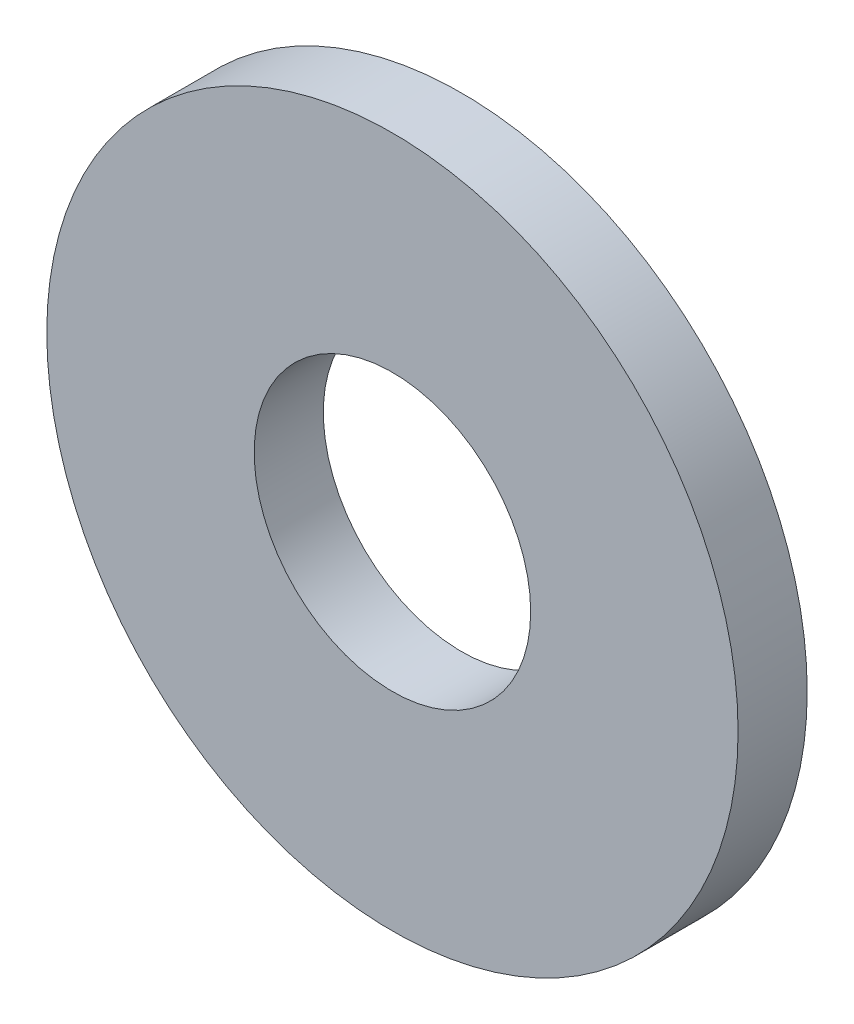
ISO-10303-21;
HEADER;
FILE_DESCRIPTION(('STEP AP214'),'2;1');
FILE_NAME('part.step','',(''),(''),'','','');
FILE_SCHEMA(('AUTOMOTIVE_DESIGN { 1 0 10303 214 1 1 1 1 }'));
ENDSEC;
DATA;
#1=APPLICATION_CONTEXT('core data for automotive mechanical design processes');
#2=APPLICATION_PROTOCOL_DEFINITION('international standard','automotive_design',2000,#1);
#3=PRODUCT_CONTEXT('',#1,'mechanical');
#4=PRODUCT('Part','Part','',(#3));
#5=PRODUCT_RELATED_PRODUCT_CATEGORY('part','',(#4));
#6=PRODUCT_DEFINITION_FORMATION('','',#4);
#7=PRODUCT_DEFINITION_CONTEXT('part definition',#1,'design');
#8=PRODUCT_DEFINITION('design','',#6,#7);
#9=PRODUCT_DEFINITION_SHAPE('','',#8);
#10=(LENGTH_UNIT() NAMED_UNIT(*) SI_UNIT(.MILLI.,.METRE.));
#11=(NAMED_UNIT(*) PLANE_ANGLE_UNIT() SI_UNIT($,.RADIAN.));
#12=(NAMED_UNIT(*) SI_UNIT($,.STERADIAN.) SOLID_ANGLE_UNIT());
#13=UNCERTAINTY_MEASURE_WITH_UNIT(LENGTH_MEASURE(1.E-05),#10,'distance_accuracy_value','');
#14=(GEOMETRIC_REPRESENTATION_CONTEXT(3) GLOBAL_UNCERTAINTY_ASSIGNED_CONTEXT((#13)) GLOBAL_UNIT_ASSIGNED_CONTEXT((#10,
#11,#12)) REPRESENTATION_CONTEXT('',''));
#15=CARTESIAN_POINT('',(0.,0.,0.));
#16=DIRECTION('',(0.,0.,1.));
#17=DIRECTION('',(1.,0.,0.));
#18=AXIS2_PLACEMENT_3D('',#15,#16,#17);
#19=CARTESIAN_POINT('',(0.,0.,0.8));
#20=DIRECTION('',(0.,0.,1.));
#21=DIRECTION('',(1.,0.,0.));
#22=AXIS2_PLACEMENT_3D('',#19,#20,#21);
#23=PLANE('',#22);
#24=CARTESIAN_POINT('',(0.,0.,0.8));
#25=DIRECTION('',(0.,0.,1.));
#26=DIRECTION('',(1.,0.,0.));
#27=AXIS2_PLACEMENT_3D('',#24,#25,#26);
#28=CIRCLE('',#27,4.);
#29=CARTESIAN_POINT('',(4.,0.,0.8));
#30=VERTEX_POINT('',#29);
#31=EDGE_CURVE('E10',#30,#30,#28,.T.);
#32=ORIENTED_EDGE('',*,*,#31,.T.);
#33=EDGE_LOOP('',(#32));
#34=FACE_BOUND('',#33,.T.);
#35=CARTESIAN_POINT('',(0.,0.,0.8));
#36=DIRECTION('',(0.,0.,1.));
#37=DIRECTION('',(1.,0.,0.));
#38=AXIS2_PLACEMENT_3D('',#35,#36,#37);
#39=CIRCLE('',#38,1.6);
#40=CARTESIAN_POINT('',(1.6,0.,0.8));
#41=VERTEX_POINT('',#40);
#42=EDGE_CURVE('E52',#41,#41,#39,.T.);
#43=ORIENTED_EDGE('',*,*,#42,.F.);
#44=EDGE_LOOP('',(#43));
#45=FACE_BOUND('',#44,.T.);
#46=ADVANCED_FACE('F41',(#34,#45),#23,.T.);
#47=CARTESIAN_POINT('',(0.,0.,0.));
#48=DIRECTION('',(0.,0.,1.));
#49=DIRECTION('',(1.,0.,0.));
#50=AXIS2_PLACEMENT_3D('',#47,#48,#49);
#51=PLANE('',#50);
#52=CARTESIAN_POINT('',(0.,0.,0.));
#53=DIRECTION('',(0.,0.,1.));
#54=DIRECTION('',(1.,0.,0.));
#55=AXIS2_PLACEMENT_3D('',#52,#53,#54);
#56=CIRCLE('',#55,4.);
#57=CARTESIAN_POINT('',(4.,0.,0.));
#58=VERTEX_POINT('',#57);
#59=EDGE_CURVE('E45',#58,#58,#56,.T.);
#60=ORIENTED_EDGE('',*,*,#59,.F.);
#61=EDGE_LOOP('',(#60));
#62=FACE_BOUND('',#61,.T.);
#63=CARTESIAN_POINT('',(0.,0.,0.));
#64=DIRECTION('',(0.,0.,1.));
#65=DIRECTION('',(1.,0.,0.));
#66=AXIS2_PLACEMENT_3D('',#63,#64,#65);
#67=CIRCLE('',#66,1.6);
#68=CARTESIAN_POINT('',(1.6,0.,0.));
#69=VERTEX_POINT('',#68);
#70=EDGE_CURVE('E54',#69,#69,#67,.T.);
#71=ORIENTED_EDGE('',*,*,#70,.T.);
#72=EDGE_LOOP('',(#71));
#73=FACE_BOUND('',#72,.T.);
#74=ADVANCED_FACE('F64',(#62,#73),#51,.F.);
#75=CARTESIAN_POINT('',(0.,0.,0.8));
#76=DIRECTION('',(0.,0.,-1.));
#77=DIRECTION('',(-1.,0.,0.));
#78=AXIS2_PLACEMENT_3D('',#75,#76,#77);
#79=CYLINDRICAL_SURFACE('',#78,4.);
#80=ORIENTED_EDGE('',*,*,#31,.F.);
#81=EDGE_LOOP('',(#80));
#82=FACE_BOUND('',#81,.T.);
#83=ORIENTED_EDGE('',*,*,#59,.T.);
#84=EDGE_LOOP('',(#83));
#85=FACE_BOUND('',#84,.T.);
#86=ADVANCED_FACE('F43',(#82,#85),#79,.T.);
#87=CARTESIAN_POINT('',(0.,0.,0.8));
#88=DIRECTION('',(0.,0.,-1.));
#89=DIRECTION('',(-1.,0.,0.));
#90=AXIS2_PLACEMENT_3D('',#87,#88,#89);
#91=CYLINDRICAL_SURFACE('',#90,1.6);
#92=ORIENTED_EDGE('',*,*,#42,.T.);
#93=EDGE_LOOP('',(#92));
#94=FACE_BOUND('',#93,.T.);
#95=ORIENTED_EDGE('',*,*,#70,.F.);
#96=EDGE_LOOP('',(#95));
#97=FACE_BOUND('',#96,.T.);
#98=ADVANCED_FACE('F60',(#94,#97),#91,.F.);
#99=CLOSED_SHELL('',(#46,#74,#86,#98));
#100=MANIFOLD_SOLID_BREP('B2',#99);
#101=ADVANCED_BREP_SHAPE_REPRESENTATION('',(#18,#100),#14);
#102=SHAPE_DEFINITION_REPRESENTATION(#9,#101);
ENDSEC;
END-ISO-10303-21;
